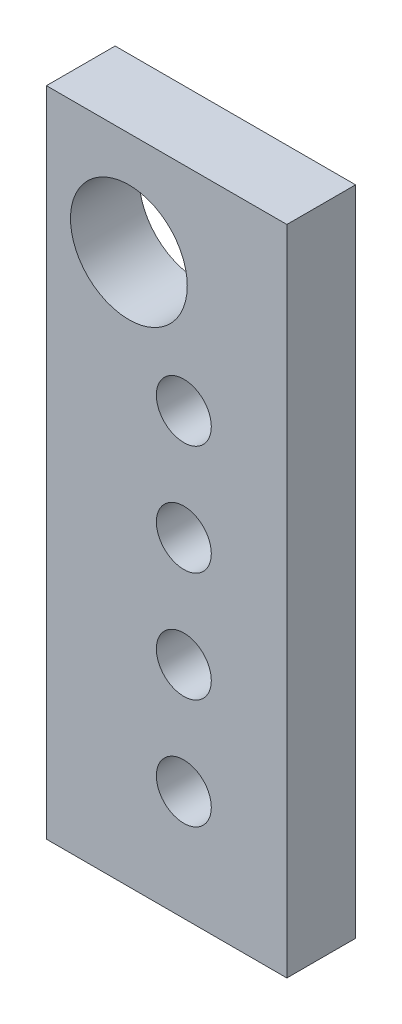
ISO-10303-21;
HEADER;
FILE_DESCRIPTION(('STEP AP214'),'2;1');
FILE_NAME('part.step','',(''),(''),'','','');
FILE_SCHEMA(('AUTOMOTIVE_DESIGN { 1 0 10303 214 1 1 1 1 }'));
ENDSEC;
DATA;
#1=APPLICATION_CONTEXT('core data for automotive mechanical design processes');
#2=APPLICATION_PROTOCOL_DEFINITION('international standard','automotive_design',2000,#1);
#3=PRODUCT_CONTEXT('',#1,'mechanical');
#4=PRODUCT('Part','Part','',(#3));
#5=PRODUCT_RELATED_PRODUCT_CATEGORY('part','',(#4));
#6=PRODUCT_DEFINITION_FORMATION('','',#4);
#7=PRODUCT_DEFINITION_CONTEXT('part definition',#1,'design');
#8=PRODUCT_DEFINITION('design','',#6,#7);
#9=PRODUCT_DEFINITION_SHAPE('','',#8);
#10=(LENGTH_UNIT() NAMED_UNIT(*) SI_UNIT(.MILLI.,.METRE.));
#11=(NAMED_UNIT(*) PLANE_ANGLE_UNIT() SI_UNIT($,.RADIAN.));
#12=(NAMED_UNIT(*) SI_UNIT($,.STERADIAN.) SOLID_ANGLE_UNIT());
#13=UNCERTAINTY_MEASURE_WITH_UNIT(LENGTH_MEASURE(1.E-05),#10,'distance_accuracy_value','');
#14=(GEOMETRIC_REPRESENTATION_CONTEXT(3) GLOBAL_UNCERTAINTY_ASSIGNED_CONTEXT((#13)) GLOBAL_UNIT_ASSIGNED_CONTEXT((#10,
#11,#12)) REPRESENTATION_CONTEXT('',''));
#15=CARTESIAN_POINT('',(0.,0.,0.));
#16=DIRECTION('',(0.,0.,1.));
#17=DIRECTION('',(1.,0.,0.));
#18=AXIS2_PLACEMENT_3D('',#15,#16,#17);
#19=CARTESIAN_POINT('',(0.,0.,5.));
#20=DIRECTION('',(0.,0.,1.));
#21=DIRECTION('',(1.,0.,0.));
#22=AXIS2_PLACEMENT_3D('',#19,#20,#21);
#23=PLANE('',#22);
#24=DIRECTION('',(0.,-1.,0.));
#25=VECTOR('',#24,1.);
#26=CARTESIAN_POINT('',(-5.49999999999999,-29.2150497725804,5.));
#27=LINE('',#26,#25);
#28=CARTESIAN_POINT('',(-5.49999999999999,7.5,5.));
#29=VERTEX_POINT('',#28);
#30=CARTESIAN_POINT('',(-5.5,-40.,5.));
#31=VERTEX_POINT('',#30);
#32=EDGE_CURVE('E61',#29,#31,#27,.T.);
#33=ORIENTED_EDGE('',*,*,#32,.T.);
#34=DIRECTION('',(1.,0.,0.));
#35=VECTOR('',#34,1.);
#36=CARTESIAN_POINT('',(-12.,-40.,5.));
#37=LINE('',#36,#35);
#38=CARTESIAN_POINT('',(12.,-40.,5.));
#39=VERTEX_POINT('',#38);
#40=EDGE_CURVE('E106',#31,#39,#37,.T.);
#41=ORIENTED_EDGE('',*,*,#40,.T.);
#42=DIRECTION('',(0.,1.,0.));
#43=VECTOR('',#42,1.);
#44=CARTESIAN_POINT('',(12.,7.50000000000001,5.));
#45=LINE('',#44,#43);
#46=CARTESIAN_POINT('',(12.,7.50000000000001,5.));
#47=VERTEX_POINT('',#46);
#48=EDGE_CURVE('E70',#39,#47,#45,.T.);
#49=ORIENTED_EDGE('',*,*,#48,.T.);
#50=DIRECTION('',(-1.,0.,0.));
#51=VECTOR('',#50,1.);
#52=CARTESIAN_POINT('',(-12.,7.5,5.));
#53=LINE('',#52,#51);
#54=EDGE_CURVE('E98',#47,#29,#53,.T.);
#55=ORIENTED_EDGE('',*,*,#54,.T.);
#56=EDGE_LOOP('',(#33,#41,#49,#55));
#57=FACE_BOUND('',#56,.T.);
#58=CARTESIAN_POINT('',(4.5,-16.,5.));
#59=DIRECTION('',(0.,0.,1.));
#60=DIRECTION('',(1.,0.,0.));
#61=AXIS2_PLACEMENT_3D('',#58,#59,#60);
#62=CIRCLE('',#61,2.);
#63=CARTESIAN_POINT('',(6.5,-16.,5.));
#64=VERTEX_POINT('',#63);
#65=EDGE_CURVE('E138',#64,#64,#62,.T.);
#66=ORIENTED_EDGE('',*,*,#65,.F.);
#67=EDGE_LOOP('',(#66));
#68=FACE_BOUND('',#67,.T.);
#69=CARTESIAN_POINT('',(4.50000000000008,-32.,5.));
#70=DIRECTION('',(0.,0.,1.));
#71=DIRECTION('',(1.,0.,0.));
#72=AXIS2_PLACEMENT_3D('',#69,#70,#71);
#73=CIRCLE('',#72,2.);
#74=CARTESIAN_POINT('',(6.50000000000008,-32.,5.));
#75=VERTEX_POINT('',#74);
#76=EDGE_CURVE('E122',#75,#75,#73,.T.);
#77=ORIENTED_EDGE('',*,*,#76,.F.);
#78=EDGE_LOOP('',(#77));
#79=FACE_BOUND('',#78,.T.);
#80=CARTESIAN_POINT('',(0.499999999999998,0.,5.));
#81=DIRECTION('',(0.,0.,1.));
#82=DIRECTION('',(1.,0.,0.));
#83=AXIS2_PLACEMENT_3D('',#80,#81,#82);
#84=CIRCLE('',#83,4.25);
#85=CARTESIAN_POINT('',(4.75,0.,5.));
#86=VERTEX_POINT('',#85);
#87=EDGE_CURVE('E113',#86,#86,#84,.T.);
#88=ORIENTED_EDGE('',*,*,#87,.F.);
#89=EDGE_LOOP('',(#88));
#90=FACE_BOUND('',#89,.T.);
#91=CARTESIAN_POINT('',(4.5,-8.,5.));
#92=DIRECTION('',(0.,0.,1.));
#93=DIRECTION('',(1.,0.,0.));
#94=AXIS2_PLACEMENT_3D('',#91,#92,#93);
#95=CIRCLE('',#94,2.);
#96=CARTESIAN_POINT('',(6.5,-8.,5.));
#97=VERTEX_POINT('',#96);
#98=EDGE_CURVE('E130',#97,#97,#95,.T.);
#99=ORIENTED_EDGE('',*,*,#98,.F.);
#100=EDGE_LOOP('',(#99));
#101=FACE_BOUND('',#100,.T.);
#102=CARTESIAN_POINT('',(4.5,-24.,5.));
#103=DIRECTION('',(0.,0.,1.));
#104=DIRECTION('',(1.,0.,0.));
#105=AXIS2_PLACEMENT_3D('',#102,#103,#104);
#106=CIRCLE('',#105,2.);
#107=CARTESIAN_POINT('',(6.5,-24.,5.));
#108=VERTEX_POINT('',#107);
#109=EDGE_CURVE('E146',#108,#108,#106,.T.);
#110=ORIENTED_EDGE('',*,*,#109,.F.);
#111=EDGE_LOOP('',(#110));
#112=FACE_BOUND('',#111,.T.);
#113=ADVANCED_FACE('F45',(#57,#68,#79,#90,#101,#112),#23,.T.);
#114=CARTESIAN_POINT('',(0.,0.,0.));
#115=DIRECTION('',(0.,0.,1.));
#116=DIRECTION('',(1.,0.,0.));
#117=AXIS2_PLACEMENT_3D('',#114,#115,#116);
#118=PLANE('',#117);
#119=DIRECTION('',(1.,0.,0.));
#120=VECTOR('',#119,1.);
#121=CARTESIAN_POINT('',(-12.,-40.,0.));
#122=LINE('',#121,#120);
#123=CARTESIAN_POINT('',(-5.5,-40.,0.));
#124=VERTEX_POINT('',#123);
#125=CARTESIAN_POINT('',(12.,-40.,0.));
#126=VERTEX_POINT('',#125);
#127=EDGE_CURVE('E92',#124,#126,#122,.T.);
#128=ORIENTED_EDGE('',*,*,#127,.F.);
#129=DIRECTION('',(0.,-1.,0.));
#130=VECTOR('',#129,1.);
#131=CARTESIAN_POINT('',(-5.49999999999999,7.50000000000001,0.));
#132=LINE('',#131,#130);
#133=CARTESIAN_POINT('',(-5.49999999999999,7.50000000000001,0.));
#134=VERTEX_POINT('',#133);
#135=EDGE_CURVE('E104',#134,#124,#132,.T.);
#136=ORIENTED_EDGE('',*,*,#135,.F.);
#137=DIRECTION('',(-1.,0.,0.));
#138=VECTOR('',#137,1.);
#139=CARTESIAN_POINT('',(-12.,7.5,0.));
#140=LINE('',#139,#138);
#141=CARTESIAN_POINT('',(12.,7.50000000000001,0.));
#142=VERTEX_POINT('',#141);
#143=EDGE_CURVE('E91',#142,#134,#140,.T.);
#144=ORIENTED_EDGE('',*,*,#143,.F.);
#145=DIRECTION('',(0.,1.,0.));
#146=VECTOR('',#145,1.);
#147=CARTESIAN_POINT('',(12.,7.50000000000001,0.));
#148=LINE('',#147,#146);
#149=EDGE_CURVE('E82',#126,#142,#148,.T.);
#150=ORIENTED_EDGE('',*,*,#149,.F.);
#151=EDGE_LOOP('',(#128,#136,#144,#150));
#152=FACE_BOUND('',#151,.T.);
#153=CARTESIAN_POINT('',(0.499999999999998,0.,0.));
#154=DIRECTION('',(0.,0.,1.));
#155=DIRECTION('',(1.,0.,0.));
#156=AXIS2_PLACEMENT_3D('',#153,#154,#155);
#157=CIRCLE('',#156,4.25);
#158=CARTESIAN_POINT('',(4.75,0.,0.));
#159=VERTEX_POINT('',#158);
#160=EDGE_CURVE('E118',#159,#159,#157,.T.);
#161=ORIENTED_EDGE('',*,*,#160,.T.);
#162=EDGE_LOOP('',(#161));
#163=FACE_BOUND('',#162,.T.);
#164=CARTESIAN_POINT('',(4.50000000000008,-32.,0.));
#165=DIRECTION('',(0.,0.,1.));
#166=DIRECTION('',(1.,0.,0.));
#167=AXIS2_PLACEMENT_3D('',#164,#165,#166);
#168=CIRCLE('',#167,2.);
#169=CARTESIAN_POINT('',(6.50000000000008,-32.,0.));
#170=VERTEX_POINT('',#169);
#171=EDGE_CURVE('E126',#170,#170,#168,.T.);
#172=ORIENTED_EDGE('',*,*,#171,.T.);
#173=EDGE_LOOP('',(#172));
#174=FACE_BOUND('',#173,.T.);
#175=CARTESIAN_POINT('',(4.5,-8.,0.));
#176=DIRECTION('',(0.,0.,1.));
#177=DIRECTION('',(1.,0.,0.));
#178=AXIS2_PLACEMENT_3D('',#175,#176,#177);
#179=CIRCLE('',#178,2.);
#180=CARTESIAN_POINT('',(6.5,-8.,0.));
#181=VERTEX_POINT('',#180);
#182=EDGE_CURVE('E134',#181,#181,#179,.T.);
#183=ORIENTED_EDGE('',*,*,#182,.T.);
#184=EDGE_LOOP('',(#183));
#185=FACE_BOUND('',#184,.T.);
#186=CARTESIAN_POINT('',(4.5,-16.,0.));
#187=DIRECTION('',(0.,0.,1.));
#188=DIRECTION('',(1.,0.,0.));
#189=AXIS2_PLACEMENT_3D('',#186,#187,#188);
#190=CIRCLE('',#189,2.);
#191=CARTESIAN_POINT('',(6.5,-16.,0.));
#192=VERTEX_POINT('',#191);
#193=EDGE_CURVE('E142',#192,#192,#190,.T.);
#194=ORIENTED_EDGE('',*,*,#193,.T.);
#195=EDGE_LOOP('',(#194));
#196=FACE_BOUND('',#195,.T.);
#197=CARTESIAN_POINT('',(4.5,-24.,0.));
#198=DIRECTION('',(0.,0.,1.));
#199=DIRECTION('',(1.,0.,0.));
#200=AXIS2_PLACEMENT_3D('',#197,#198,#199);
#201=CIRCLE('',#200,2.);
#202=CARTESIAN_POINT('',(6.5,-24.,0.));
#203=VERTEX_POINT('',#202);
#204=EDGE_CURVE('E150',#203,#203,#201,.T.);
#205=ORIENTED_EDGE('',*,*,#204,.T.);
#206=EDGE_LOOP('',(#205));
#207=FACE_BOUND('',#206,.T.);
#208=ADVANCED_FACE('F101',(#152,#163,#174,#185,#196,#207),#118,.F.);
#209=CARTESIAN_POINT('',(-12.,-40.,5.));
#210=DIRECTION('',(0.,1.,0.));
#211=DIRECTION('',(-1.,0.,0.));
#212=AXIS2_PLACEMENT_3D('',#209,#210,#211);
#213=PLANE('',#212);
#214=ORIENTED_EDGE('',*,*,#40,.F.);
#215=DIRECTION('',(0.,0.,-1.));
#216=VECTOR('',#215,1.);
#217=CARTESIAN_POINT('',(-5.5,-40.,5.));
#218=LINE('',#217,#216);
#219=EDGE_CURVE('E154',#31,#124,#218,.T.);
#220=ORIENTED_EDGE('',*,*,#219,.T.);
#221=ORIENTED_EDGE('',*,*,#127,.T.);
#222=DIRECTION('',(0.,0.,-1.));
#223=VECTOR('',#222,1.);
#224=CARTESIAN_POINT('',(12.,-40.,5.));
#225=LINE('',#224,#223);
#226=EDGE_CURVE('E11',#39,#126,#225,.T.);
#227=ORIENTED_EDGE('',*,*,#226,.F.);
#228=EDGE_LOOP('',(#214,#220,#221,#227));
#229=FACE_BOUND('',#228,.T.);
#230=ADVANCED_FACE('F47',(#229),#213,.F.);
#231=CARTESIAN_POINT('',(12.,7.50000000000001,5.));
#232=DIRECTION('',(-1.,0.,0.));
#233=DIRECTION('',(0.,-1.,0.));
#234=AXIS2_PLACEMENT_3D('',#231,#232,#233);
#235=PLANE('',#234);
#236=ORIENTED_EDGE('',*,*,#149,.T.);
#237=DIRECTION('',(0.,0.,-1.));
#238=VECTOR('',#237,1.);
#239=CARTESIAN_POINT('',(12.,7.50000000000001,5.));
#240=LINE('',#239,#238);
#241=EDGE_CURVE('E54',#47,#142,#240,.T.);
#242=ORIENTED_EDGE('',*,*,#241,.F.);
#243=ORIENTED_EDGE('',*,*,#48,.F.);
#244=ORIENTED_EDGE('',*,*,#226,.T.);
#245=EDGE_LOOP('',(#236,#242,#243,#244));
#246=FACE_BOUND('',#245,.T.);
#247=ADVANCED_FACE('F84',(#246),#235,.F.);
#248=CARTESIAN_POINT('',(-12.,7.5,5.));
#249=DIRECTION('',(0.,-1.,0.));
#250=DIRECTION('',(1.,0.,0.));
#251=AXIS2_PLACEMENT_3D('',#248,#249,#250);
#252=PLANE('',#251);
#253=ORIENTED_EDGE('',*,*,#143,.T.);
#254=DIRECTION('',(0.,0.,-1.));
#255=VECTOR('',#254,1.);
#256=CARTESIAN_POINT('',(-5.49999999999999,7.50000000000001,5.));
#257=LINE('',#256,#255);
#258=EDGE_CURVE('E161',#29,#134,#257,.T.);
#259=ORIENTED_EDGE('',*,*,#258,.F.);
#260=ORIENTED_EDGE('',*,*,#54,.F.);
#261=ORIENTED_EDGE('',*,*,#241,.T.);
#262=EDGE_LOOP('',(#253,#259,#260,#261));
#263=FACE_BOUND('',#262,.T.);
#264=ADVANCED_FACE('F96',(#263),#252,.F.);
#265=CARTESIAN_POINT('',(0.499999999999998,0.,5.));
#266=DIRECTION('',(0.,0.,-1.));
#267=DIRECTION('',(-1.,0.,0.));
#268=AXIS2_PLACEMENT_3D('',#265,#266,#267);
#269=CYLINDRICAL_SURFACE('',#268,4.25);
#270=ORIENTED_EDGE('',*,*,#87,.T.);
#271=EDGE_LOOP('',(#270));
#272=FACE_BOUND('',#271,.T.);
#273=ORIENTED_EDGE('',*,*,#160,.F.);
#274=EDGE_LOOP('',(#273));
#275=FACE_BOUND('',#274,.T.);
#276=ADVANCED_FACE('F191',(#272,#275),#269,.F.);
#277=CARTESIAN_POINT('',(4.50000000000008,-32.,5.));
#278=DIRECTION('',(0.,0.,-1.));
#279=DIRECTION('',(-1.,0.,0.));
#280=AXIS2_PLACEMENT_3D('',#277,#278,#279);
#281=CYLINDRICAL_SURFACE('',#280,2.);
#282=ORIENTED_EDGE('',*,*,#76,.T.);
#283=EDGE_LOOP('',(#282));
#284=FACE_BOUND('',#283,.T.);
#285=ORIENTED_EDGE('',*,*,#171,.F.);
#286=EDGE_LOOP('',(#285));
#287=FACE_BOUND('',#286,.T.);
#288=ADVANCED_FACE('F220',(#284,#287),#281,.F.);
#289=CARTESIAN_POINT('',(4.5,-8.,5.));
#290=DIRECTION('',(0.,0.,-1.));
#291=DIRECTION('',(-1.,0.,0.));
#292=AXIS2_PLACEMENT_3D('',#289,#290,#291);
#293=CYLINDRICAL_SURFACE('',#292,2.);
#294=ORIENTED_EDGE('',*,*,#98,.T.);
#295=EDGE_LOOP('',(#294));
#296=FACE_BOUND('',#295,.T.);
#297=ORIENTED_EDGE('',*,*,#182,.F.);
#298=EDGE_LOOP('',(#297));
#299=FACE_BOUND('',#298,.T.);
#300=ADVANCED_FACE('F229',(#296,#299),#293,.F.);
#301=CARTESIAN_POINT('',(4.5,-16.,5.));
#302=DIRECTION('',(0.,0.,-1.));
#303=DIRECTION('',(-1.,0.,0.));
#304=AXIS2_PLACEMENT_3D('',#301,#302,#303);
#305=CYLINDRICAL_SURFACE('',#304,2.);
#306=ORIENTED_EDGE('',*,*,#65,.T.);
#307=EDGE_LOOP('',(#306));
#308=FACE_BOUND('',#307,.T.);
#309=ORIENTED_EDGE('',*,*,#193,.F.);
#310=EDGE_LOOP('',(#309));
#311=FACE_BOUND('',#310,.T.);
#312=ADVANCED_FACE('F181',(#308,#311),#305,.F.);
#313=CARTESIAN_POINT('',(4.5,-24.,5.));
#314=DIRECTION('',(0.,0.,-1.));
#315=DIRECTION('',(-1.,0.,0.));
#316=AXIS2_PLACEMENT_3D('',#313,#314,#315);
#317=CYLINDRICAL_SURFACE('',#316,2.);
#318=ORIENTED_EDGE('',*,*,#109,.T.);
#319=EDGE_LOOP('',(#318));
#320=FACE_BOUND('',#319,.T.);
#321=ORIENTED_EDGE('',*,*,#204,.F.);
#322=EDGE_LOOP('',(#321));
#323=FACE_BOUND('',#322,.T.);
#324=ADVANCED_FACE('F175',(#320,#323),#317,.F.);
#325=CARTESIAN_POINT('',(-5.49999999999999,7.50000000000001,5.));
#326=DIRECTION('',(1.,0.,0.));
#327=DIRECTION('',(0.,1.,0.));
#328=AXIS2_PLACEMENT_3D('',#325,#326,#327);
#329=PLANE('',#328);
#330=ORIENTED_EDGE('',*,*,#32,.F.);
#331=ORIENTED_EDGE('',*,*,#258,.T.);
#332=ORIENTED_EDGE('',*,*,#135,.T.);
#333=ORIENTED_EDGE('',*,*,#219,.F.);
#334=EDGE_LOOP('',(#330,#331,#332,#333));
#335=FACE_BOUND('',#334,.T.);
#336=ADVANCED_FACE('F173',(#335),#329,.F.);
#337=CLOSED_SHELL('',(#113,#208,#230,#247,#264,#276,#288,#300,#312,#324,#336));
#338=MANIFOLD_SOLID_BREP('B2',#337);
#339=ADVANCED_BREP_SHAPE_REPRESENTATION('',(#18,#338),#14);
#340=SHAPE_DEFINITION_REPRESENTATION(#9,#339);
ENDSEC;
END-ISO-10303-21;
